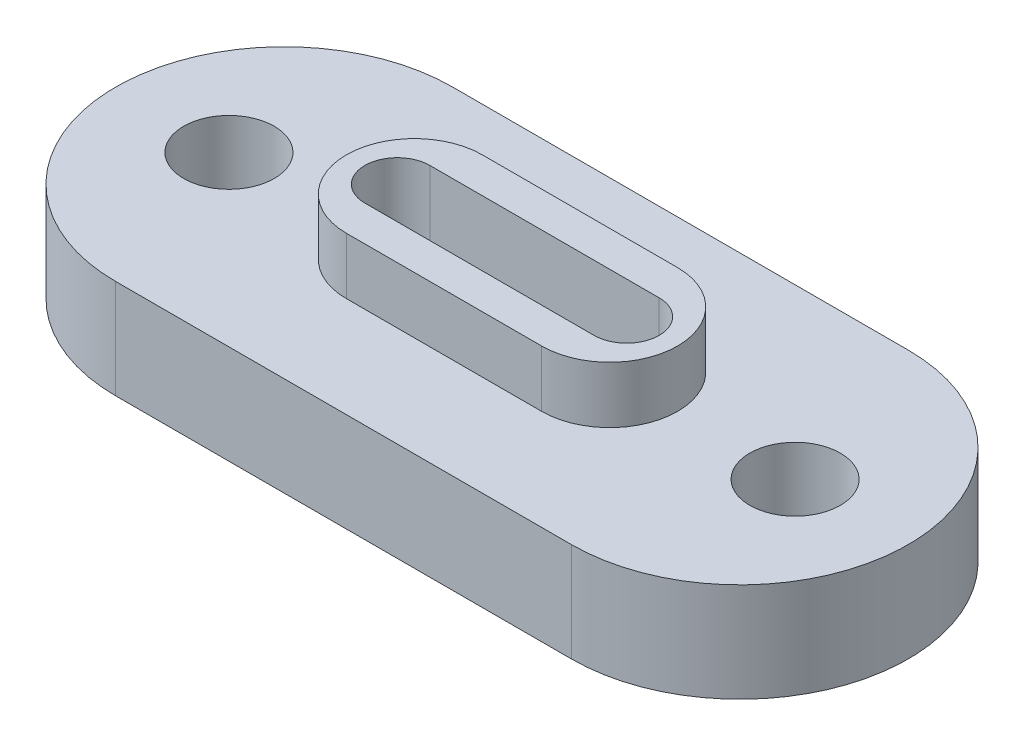
ISO-10303-21;
HEADER;
FILE_DESCRIPTION(('STEP AP214'),'2;1');
FILE_NAME('part.step','',(''),(''),'','','');
FILE_SCHEMA(('AUTOMOTIVE_DESIGN { 1 0 10303 214 1 1 1 1 }'));
ENDSEC;
DATA;
#1=APPLICATION_CONTEXT('core data for automotive mechanical design processes');
#2=APPLICATION_PROTOCOL_DEFINITION('international standard','automotive_design',2000,#1);
#3=PRODUCT_CONTEXT('',#1,'mechanical');
#4=PRODUCT('Part','Part','',(#3));
#5=PRODUCT_RELATED_PRODUCT_CATEGORY('part','',(#4));
#6=PRODUCT_DEFINITION_FORMATION('','',#4);
#7=PRODUCT_DEFINITION_CONTEXT('part definition',#1,'design');
#8=PRODUCT_DEFINITION('design','',#6,#7);
#9=PRODUCT_DEFINITION_SHAPE('','',#8);
#10=(LENGTH_UNIT() NAMED_UNIT(*) SI_UNIT(.MILLI.,.METRE.));
#11=(NAMED_UNIT(*) PLANE_ANGLE_UNIT() SI_UNIT($,.RADIAN.));
#12=(NAMED_UNIT(*) SI_UNIT($,.STERADIAN.) SOLID_ANGLE_UNIT());
#13=UNCERTAINTY_MEASURE_WITH_UNIT(LENGTH_MEASURE(1.E-05),#10,'distance_accuracy_value','');
#14=(GEOMETRIC_REPRESENTATION_CONTEXT(3) GLOBAL_UNCERTAINTY_ASSIGNED_CONTEXT((#13)) GLOBAL_UNIT_ASSIGNED_CONTEXT((#10,
#11,#12)) REPRESENTATION_CONTEXT('',''));
#15=CARTESIAN_POINT('',(0.,0.,0.));
#16=DIRECTION('',(0.,0.,1.));
#17=DIRECTION('',(1.,0.,0.));
#18=AXIS2_PLACEMENT_3D('',#15,#16,#17);
#19=CARTESIAN_POINT('',(-3.45,2.,0.));
#20=DIRECTION('',(0.,1.,0.));
#21=DIRECTION('',(0.,0.,1.));
#22=AXIS2_PLACEMENT_3D('',#19,#20,#21);
#23=PLANE('',#22);
#24=CARTESIAN_POINT('',(-3.45,2.,0.));
#25=DIRECTION('',(0.,1.,0.));
#26=DIRECTION('',(0.,0.,1.));
#27=AXIS2_PLACEMENT_3D('',#24,#25,#26);
#28=CIRCLE('',#27,2.4);
#29=CARTESIAN_POINT('',(-3.45,2.,-2.4));
#30=VERTEX_POINT('',#29);
#31=CARTESIAN_POINT('',(-3.45,2.,2.4));
#32=VERTEX_POINT('',#31);
#33=EDGE_CURVE('E99',#30,#32,#28,.T.);
#34=ORIENTED_EDGE('',*,*,#33,.T.);
#35=DIRECTION('',(1.,0.,0.));
#36=VECTOR('',#35,1.);
#37=CARTESIAN_POINT('',(-3.45,2.,2.4));
#38=LINE('',#37,#36);
#39=CARTESIAN_POINT('',(3.45,2.,2.4));
#40=VERTEX_POINT('',#39);
#41=EDGE_CURVE('E92',#32,#40,#38,.T.);
#42=ORIENTED_EDGE('',*,*,#41,.T.);
#43=CARTESIAN_POINT('',(3.45,2.,0.));
#44=DIRECTION('',(0.,1.,0.));
#45=DIRECTION('',(0.,0.,1.));
#46=AXIS2_PLACEMENT_3D('',#43,#44,#45);
#47=CIRCLE('',#46,2.4);
#48=CARTESIAN_POINT('',(3.45,2.,-2.4));
#49=VERTEX_POINT('',#48);
#50=EDGE_CURVE('E96',#40,#49,#47,.T.);
#51=ORIENTED_EDGE('',*,*,#50,.T.);
#52=DIRECTION('',(-1.,0.,0.));
#53=VECTOR('',#52,1.);
#54=CARTESIAN_POINT('',(-3.45,2.,-2.4));
#55=LINE('',#54,#53);
#56=EDGE_CURVE('E64',#49,#30,#55,.T.);
#57=ORIENTED_EDGE('',*,*,#56,.T.);
#58=EDGE_LOOP('',(#34,#42,#51,#57));
#59=FACE_BOUND('',#58,.T.);
#60=DIRECTION('',(1.,0.,0.));
#61=VECTOR('',#60,1.);
#62=CARTESIAN_POINT('',(-4.05,2.,1.15));
#63=LINE('',#62,#61);
#64=CARTESIAN_POINT('',(-4.05,2.,1.15));
#65=VERTEX_POINT('',#64);
#66=CARTESIAN_POINT('',(4.05,2.,1.15));
#67=VERTEX_POINT('',#66);
#68=EDGE_CURVE('E160',#65,#67,#63,.T.);
#69=ORIENTED_EDGE('',*,*,#68,.F.);
#70=CARTESIAN_POINT('',(-4.05,2.,0.));
#71=DIRECTION('',(0.,1.,0.));
#72=DIRECTION('',(0.,0.,1.));
#73=AXIS2_PLACEMENT_3D('',#70,#71,#72);
#74=CIRCLE('',#73,1.15);
#75=CARTESIAN_POINT('',(-4.05,2.,-1.15));
#76=VERTEX_POINT('',#75);
#77=EDGE_CURVE('E151',#76,#65,#74,.T.);
#78=ORIENTED_EDGE('',*,*,#77,.F.);
#79=DIRECTION('',(-1.,0.,0.));
#80=VECTOR('',#79,1.);
#81=CARTESIAN_POINT('',(-4.05,2.,-1.15));
#82=LINE('',#81,#80);
#83=CARTESIAN_POINT('',(4.05,2.,-1.15));
#84=VERTEX_POINT('',#83);
#85=EDGE_CURVE('E85',#84,#76,#82,.T.);
#86=ORIENTED_EDGE('',*,*,#85,.F.);
#87=CARTESIAN_POINT('',(4.05,2.,0.));
#88=DIRECTION('',(0.,1.,0.));
#89=DIRECTION('',(0.,0.,1.));
#90=AXIS2_PLACEMENT_3D('',#87,#88,#89);
#91=CIRCLE('',#90,1.15);
#92=EDGE_CURVE('E174',#67,#84,#91,.T.);
#93=ORIENTED_EDGE('',*,*,#92,.F.);
#94=EDGE_LOOP('',(#69,#78,#86,#93));
#95=FACE_BOUND('',#94,.T.);
#96=ADVANCED_FACE('F39',(#59,#95),#23,.T.);
#97=CARTESIAN_POINT('',(-3.45,2.,0.));
#98=DIRECTION('',(0.,-1.,0.));
#99=DIRECTION('',(0.,0.,-1.));
#100=AXIS2_PLACEMENT_3D('',#97,#98,#99);
#101=CYLINDRICAL_SURFACE('',#100,2.4);
#102=CARTESIAN_POINT('',(-3.45,0.,0.));
#103=DIRECTION('',(0.,1.,0.));
#104=DIRECTION('',(0.,0.,1.));
#105=AXIS2_PLACEMENT_3D('',#102,#103,#104);
#106=CIRCLE('',#105,2.4);
#107=CARTESIAN_POINT('',(-3.45,0.,-2.4));
#108=VERTEX_POINT('',#107);
#109=CARTESIAN_POINT('',(-3.45,0.,2.4));
#110=VERTEX_POINT('',#109);
#111=EDGE_CURVE('E119',#108,#110,#106,.T.);
#112=ORIENTED_EDGE('',*,*,#111,.T.);
#113=DIRECTION('',(0.,-1.,0.));
#114=VECTOR('',#113,1.);
#115=CARTESIAN_POINT('',(-3.45,2.,2.4));
#116=LINE('',#115,#114);
#117=EDGE_CURVE('E11',#32,#110,#116,.T.);
#118=ORIENTED_EDGE('',*,*,#117,.F.);
#119=ORIENTED_EDGE('',*,*,#33,.F.);
#120=DIRECTION('',(0.,-1.,0.));
#121=VECTOR('',#120,1.);
#122=CARTESIAN_POINT('',(-3.45,2.,-2.4));
#123=LINE('',#122,#121);
#124=EDGE_CURVE('E115',#30,#108,#123,.T.);
#125=ORIENTED_EDGE('',*,*,#124,.T.);
#126=EDGE_LOOP('',(#112,#118,#119,#125));
#127=FACE_BOUND('',#126,.T.);
#128=ADVANCED_FACE('F41',(#127),#101,.T.);
#129=CARTESIAN_POINT('',(-3.45,2.,2.4));
#130=DIRECTION('',(0.,0.,-1.));
#131=DIRECTION('',(-1.,0.,0.));
#132=AXIS2_PLACEMENT_3D('',#129,#130,#131);
#133=PLANE('',#132);
#134=DIRECTION('',(1.,0.,0.));
#135=VECTOR('',#134,1.);
#136=CARTESIAN_POINT('',(-3.45,0.,2.4));
#137=LINE('',#136,#135);
#138=CARTESIAN_POINT('',(3.45,0.,2.4));
#139=VERTEX_POINT('',#138);
#140=EDGE_CURVE('E106',#110,#139,#137,.T.);
#141=ORIENTED_EDGE('',*,*,#140,.T.);
#142=DIRECTION('',(0.,-1.,0.));
#143=VECTOR('',#142,1.);
#144=CARTESIAN_POINT('',(3.45,2.,2.4));
#145=LINE('',#144,#143);
#146=EDGE_CURVE('E48',#40,#139,#145,.T.);
#147=ORIENTED_EDGE('',*,*,#146,.F.);
#148=ORIENTED_EDGE('',*,*,#41,.F.);
#149=ORIENTED_EDGE('',*,*,#117,.T.);
#150=EDGE_LOOP('',(#141,#147,#148,#149));
#151=FACE_BOUND('',#150,.T.);
#152=ADVANCED_FACE('F105',(#151),#133,.F.);
#153=CARTESIAN_POINT('',(3.45,2.,0.));
#154=DIRECTION('',(0.,-1.,0.));
#155=DIRECTION('',(0.,0.,-1.));
#156=AXIS2_PLACEMENT_3D('',#153,#154,#155);
#157=CYLINDRICAL_SURFACE('',#156,2.4);
#158=CARTESIAN_POINT('',(3.45,0.,0.));
#159=DIRECTION('',(0.,1.,0.));
#160=DIRECTION('',(0.,0.,1.));
#161=AXIS2_PLACEMENT_3D('',#158,#159,#160);
#162=CIRCLE('',#161,2.4);
#163=CARTESIAN_POINT('',(3.45,0.,-2.4));
#164=VERTEX_POINT('',#163);
#165=EDGE_CURVE('E77',#139,#164,#162,.T.);
#166=ORIENTED_EDGE('',*,*,#165,.T.);
#167=DIRECTION('',(0.,-1.,0.));
#168=VECTOR('',#167,1.);
#169=CARTESIAN_POINT('',(3.45,2.,-2.4));
#170=LINE('',#169,#168);
#171=EDGE_CURVE('E109',#49,#164,#170,.T.);
#172=ORIENTED_EDGE('',*,*,#171,.F.);
#173=ORIENTED_EDGE('',*,*,#50,.F.);
#174=ORIENTED_EDGE('',*,*,#146,.T.);
#175=EDGE_LOOP('',(#166,#172,#173,#174));
#176=FACE_BOUND('',#175,.T.);
#177=ADVANCED_FACE('F110',(#176),#157,.T.);
#178=CARTESIAN_POINT('',(-3.45,2.,-2.4));
#179=DIRECTION('',(0.,0.,1.));
#180=DIRECTION('',(1.,0.,0.));
#181=AXIS2_PLACEMENT_3D('',#178,#179,#180);
#182=PLANE('',#181);
#183=DIRECTION('',(-1.,0.,0.));
#184=VECTOR('',#183,1.);
#185=CARTESIAN_POINT('',(-3.45,0.,-2.4));
#186=LINE('',#185,#184);
#187=EDGE_CURVE('E128',#164,#108,#186,.T.);
#188=ORIENTED_EDGE('',*,*,#187,.T.);
#189=ORIENTED_EDGE('',*,*,#124,.F.);
#190=ORIENTED_EDGE('',*,*,#56,.F.);
#191=ORIENTED_EDGE('',*,*,#171,.T.);
#192=EDGE_LOOP('',(#188,#189,#190,#191));
#193=FACE_BOUND('',#192,.T.);
#194=ADVANCED_FACE('F138',(#193),#182,.F.);
#195=CARTESIAN_POINT('',(-4.05,2.,0.));
#196=DIRECTION('',(0.,-1.,0.));
#197=DIRECTION('',(0.,0.,-1.));
#198=AXIS2_PLACEMENT_3D('',#195,#196,#197);
#199=CYLINDRICAL_SURFACE('',#198,1.15);
#200=DIRECTION('',(0.,-1.,0.));
#201=VECTOR('',#200,1.);
#202=CARTESIAN_POINT('',(-4.05,2.,1.15));
#203=LINE('',#202,#201);
#204=CARTESIAN_POINT('',(-4.05,-3.5,1.15));
#205=VERTEX_POINT('',#204);
#206=EDGE_CURVE('E123',#65,#205,#203,.T.);
#207=ORIENTED_EDGE('',*,*,#206,.T.);
#208=CARTESIAN_POINT('',(-4.05,-3.5,0.));
#209=DIRECTION('',(0.,-1.,0.));
#210=DIRECTION('',(0.,0.,-1.));
#211=AXIS2_PLACEMENT_3D('',#208,#209,#210);
#212=CIRCLE('',#211,1.15);
#213=CARTESIAN_POINT('',(-4.05,-3.5,-1.15));
#214=VERTEX_POINT('',#213);
#215=EDGE_CURVE('E204',#205,#214,#212,.T.);
#216=ORIENTED_EDGE('',*,*,#215,.T.);
#217=DIRECTION('',(0.,-1.,0.));
#218=VECTOR('',#217,1.);
#219=CARTESIAN_POINT('',(-4.05,2.,-1.15));
#220=LINE('',#219,#218);
#221=EDGE_CURVE('E157',#76,#214,#220,.T.);
#222=ORIENTED_EDGE('',*,*,#221,.F.);
#223=ORIENTED_EDGE('',*,*,#77,.T.);
#224=EDGE_LOOP('',(#207,#216,#222,#223));
#225=FACE_BOUND('',#224,.T.);
#226=ADVANCED_FACE('F153',(#225),#199,.F.);
#227=CARTESIAN_POINT('',(-4.05,2.,1.15));
#228=DIRECTION('',(0.,0.,-1.));
#229=DIRECTION('',(-1.,0.,0.));
#230=AXIS2_PLACEMENT_3D('',#227,#228,#229);
#231=PLANE('',#230);
#232=DIRECTION('',(0.,-1.,0.));
#233=VECTOR('',#232,1.);
#234=CARTESIAN_POINT('',(4.05,2.,1.15));
#235=LINE('',#234,#233);
#236=CARTESIAN_POINT('',(4.05,-3.5,1.15));
#237=VERTEX_POINT('',#236);
#238=EDGE_CURVE('E171',#67,#237,#235,.T.);
#239=ORIENTED_EDGE('',*,*,#238,.T.);
#240=DIRECTION('',(-1.,0.,0.));
#241=VECTOR('',#240,1.);
#242=CARTESIAN_POINT('',(4.05,-3.5,1.15));
#243=LINE('',#242,#241);
#244=EDGE_CURVE('E168',#237,#205,#243,.T.);
#245=ORIENTED_EDGE('',*,*,#244,.T.);
#246=ORIENTED_EDGE('',*,*,#206,.F.);
#247=ORIENTED_EDGE('',*,*,#68,.T.);
#248=EDGE_LOOP('',(#239,#245,#246,#247));
#249=FACE_BOUND('',#248,.T.);
#250=ADVANCED_FACE('F165',(#249),#231,.T.);
#251=CARTESIAN_POINT('',(4.05,2.,0.));
#252=DIRECTION('',(0.,-1.,0.));
#253=DIRECTION('',(0.,0.,-1.));
#254=AXIS2_PLACEMENT_3D('',#251,#252,#253);
#255=CYLINDRICAL_SURFACE('',#254,1.15);
#256=DIRECTION('',(0.,-1.,0.));
#257=VECTOR('',#256,1.);
#258=CARTESIAN_POINT('',(4.05,2.,-1.15));
#259=LINE('',#258,#257);
#260=CARTESIAN_POINT('',(4.05,-3.5,-1.15));
#261=VERTEX_POINT('',#260);
#262=EDGE_CURVE('E55',#84,#261,#259,.T.);
#263=ORIENTED_EDGE('',*,*,#262,.T.);
#264=CARTESIAN_POINT('',(4.05,-3.5,0.));
#265=DIRECTION('',(0.,-1.,0.));
#266=DIRECTION('',(0.,0.,-1.));
#267=AXIS2_PLACEMENT_3D('',#264,#265,#266);
#268=CIRCLE('',#267,1.15);
#269=EDGE_CURVE('E194',#261,#237,#268,.T.);
#270=ORIENTED_EDGE('',*,*,#269,.T.);
#271=ORIENTED_EDGE('',*,*,#238,.F.);
#272=ORIENTED_EDGE('',*,*,#92,.T.);
#273=EDGE_LOOP('',(#263,#270,#271,#272));
#274=FACE_BOUND('',#273,.T.);
#275=ADVANCED_FACE('F195',(#274),#255,.F.);
#276=CARTESIAN_POINT('',(-4.05,2.,-1.15));
#277=DIRECTION('',(0.,0.,1.));
#278=DIRECTION('',(1.,0.,0.));
#279=AXIS2_PLACEMENT_3D('',#276,#277,#278);
#280=PLANE('',#279);
#281=ORIENTED_EDGE('',*,*,#221,.T.);
#282=DIRECTION('',(1.,0.,0.));
#283=VECTOR('',#282,1.);
#284=CARTESIAN_POINT('',(4.05,-3.5,-1.15));
#285=LINE('',#284,#283);
#286=EDGE_CURVE('E208',#214,#261,#285,.T.);
#287=ORIENTED_EDGE('',*,*,#286,.T.);
#288=ORIENTED_EDGE('',*,*,#262,.F.);
#289=ORIENTED_EDGE('',*,*,#85,.T.);
#290=EDGE_LOOP('',(#281,#287,#288,#289));
#291=FACE_BOUND('',#290,.T.);
#292=ADVANCED_FACE('F354',(#291),#280,.T.);
#293=CARTESIAN_POINT('',(-8.05,-3.5,0.));
#294=DIRECTION('',(0.,-1.,0.));
#295=DIRECTION('',(0.,0.,-1.));
#296=AXIS2_PLACEMENT_3D('',#293,#294,#295);
#297=PLANE('',#296);
#298=CARTESIAN_POINT('',(-10.,-3.5,0.));
#299=DIRECTION('',(0.,-1.,0.));
#300=DIRECTION('',(0.,0.,-1.));
#301=AXIS2_PLACEMENT_3D('',#298,#299,#300);
#302=CIRCLE('',#301,1.6);
#303=CARTESIAN_POINT('',(-10.,-3.5,-1.6));
#304=VERTEX_POINT('',#303);
#305=EDGE_CURVE('E200',#304,#304,#302,.T.);
#306=ORIENTED_EDGE('',*,*,#305,.F.);
#307=EDGE_LOOP('',(#306));
#308=FACE_BOUND('',#307,.T.);
#309=CARTESIAN_POINT('',(-8.05,-3.5,0.));
#310=DIRECTION('',(0.,-1.,0.));
#311=DIRECTION('',(0.,0.,-1.));
#312=AXIS2_PLACEMENT_3D('',#309,#310,#311);
#313=CIRCLE('',#312,5.95);
#314=CARTESIAN_POINT('',(-8.05,-3.5,5.95));
#315=VERTEX_POINT('',#314);
#316=CARTESIAN_POINT('',(-8.05,-3.5,-5.95));
#317=VERTEX_POINT('',#316);
#318=EDGE_CURVE('E215',#315,#317,#313,.T.);
#319=ORIENTED_EDGE('',*,*,#318,.T.);
#320=DIRECTION('',(1.,0.,0.));
#321=VECTOR('',#320,1.);
#322=CARTESIAN_POINT('',(-8.05,-3.5,-5.95));
#323=LINE('',#322,#321);
#324=CARTESIAN_POINT('',(8.05,-3.5,-5.95));
#325=VERTEX_POINT('',#324);
#326=EDGE_CURVE('E219',#317,#325,#323,.T.);
#327=ORIENTED_EDGE('',*,*,#326,.T.);
#328=CARTESIAN_POINT('',(8.05,-3.5,0.));
#329=DIRECTION('',(0.,-1.,0.));
#330=DIRECTION('',(0.,0.,-1.));
#331=AXIS2_PLACEMENT_3D('',#328,#329,#330);
#332=CIRCLE('',#331,5.95);
#333=CARTESIAN_POINT('',(8.05,-3.5,5.95));
#334=VERTEX_POINT('',#333);
#335=EDGE_CURVE('E224',#325,#334,#332,.T.);
#336=ORIENTED_EDGE('',*,*,#335,.T.);
#337=DIRECTION('',(-1.,0.,0.));
#338=VECTOR('',#337,1.);
#339=CARTESIAN_POINT('',(-8.05,-3.5,5.95));
#340=LINE('',#339,#338);
#341=EDGE_CURVE('E228',#334,#315,#340,.T.);
#342=ORIENTED_EDGE('',*,*,#341,.T.);
#343=EDGE_LOOP('',(#319,#327,#336,#342));
#344=FACE_BOUND('',#343,.T.);
#345=ORIENTED_EDGE('',*,*,#244,.F.);
#346=ORIENTED_EDGE('',*,*,#269,.F.);
#347=ORIENTED_EDGE('',*,*,#286,.F.);
#348=ORIENTED_EDGE('',*,*,#215,.F.);
#349=EDGE_LOOP('',(#345,#346,#347,#348));
#350=FACE_BOUND('',#349,.T.);
#351=CARTESIAN_POINT('',(10.,-3.5,0.));
#352=DIRECTION('',(0.,-1.,0.));
#353=DIRECTION('',(0.,0.,-1.));
#354=AXIS2_PLACEMENT_3D('',#351,#352,#353);
#355=CIRCLE('',#354,1.6);
#356=CARTESIAN_POINT('',(10.,-3.5,-1.6));
#357=VERTEX_POINT('',#356);
#358=EDGE_CURVE('E415',#357,#357,#355,.T.);
#359=ORIENTED_EDGE('',*,*,#358,.F.);
#360=EDGE_LOOP('',(#359));
#361=FACE_BOUND('',#360,.T.);
#362=ADVANCED_FACE('F202',(#308,#344,#350,#361),#297,.T.);
#363=CARTESIAN_POINT('',(-8.05,0.,0.));
#364=DIRECTION('',(0.,-1.,0.));
#365=DIRECTION('',(0.,0.,-1.));
#366=AXIS2_PLACEMENT_3D('',#363,#364,#365);
#367=PLANE('',#366);
#368=ORIENTED_EDGE('',*,*,#111,.F.);
#369=ORIENTED_EDGE('',*,*,#187,.F.);
#370=ORIENTED_EDGE('',*,*,#165,.F.);
#371=ORIENTED_EDGE('',*,*,#140,.F.);
#372=EDGE_LOOP('',(#368,#369,#370,#371));
#373=FACE_BOUND('',#372,.T.);
#374=CARTESIAN_POINT('',(-8.05,0.,0.));
#375=DIRECTION('',(0.,-1.,0.));
#376=DIRECTION('',(0.,0.,-1.));
#377=AXIS2_PLACEMENT_3D('',#374,#375,#376);
#378=CIRCLE('',#377,5.95);
#379=CARTESIAN_POINT('',(-8.05,0.,5.95));
#380=VERTEX_POINT('',#379);
#381=CARTESIAN_POINT('',(-8.05,0.,-5.95));
#382=VERTEX_POINT('',#381);
#383=EDGE_CURVE('E214',#380,#382,#378,.T.);
#384=ORIENTED_EDGE('',*,*,#383,.F.);
#385=DIRECTION('',(-1.,0.,0.));
#386=VECTOR('',#385,1.);
#387=CARTESIAN_POINT('',(-8.05,0.,5.95));
#388=LINE('',#387,#386);
#389=CARTESIAN_POINT('',(8.05,0.,5.95));
#390=VERTEX_POINT('',#389);
#391=EDGE_CURVE('E220',#390,#380,#388,.T.);
#392=ORIENTED_EDGE('',*,*,#391,.F.);
#393=CARTESIAN_POINT('',(8.05,0.,0.));
#394=DIRECTION('',(0.,-1.,0.));
#395=DIRECTION('',(0.,0.,-1.));
#396=AXIS2_PLACEMENT_3D('',#393,#394,#395);
#397=CIRCLE('',#396,5.95);
#398=CARTESIAN_POINT('',(8.05,0.,-5.95));
#399=VERTEX_POINT('',#398);
#400=EDGE_CURVE('E240',#399,#390,#397,.T.);
#401=ORIENTED_EDGE('',*,*,#400,.F.);
#402=DIRECTION('',(1.,0.,0.));
#403=VECTOR('',#402,1.);
#404=CARTESIAN_POINT('',(-8.05,0.,-5.95));
#405=LINE('',#404,#403);
#406=EDGE_CURVE('E236',#382,#399,#405,.T.);
#407=ORIENTED_EDGE('',*,*,#406,.F.);
#408=EDGE_LOOP('',(#384,#392,#401,#407));
#409=FACE_BOUND('',#408,.T.);
#410=CARTESIAN_POINT('',(-10.,0.,0.));
#411=DIRECTION('',(0.,-1.,0.));
#412=DIRECTION('',(0.,0.,-1.));
#413=AXIS2_PLACEMENT_3D('',#410,#411,#412);
#414=CIRCLE('',#413,1.6);
#415=CARTESIAN_POINT('',(-10.,0.,-1.6));
#416=VERTEX_POINT('',#415);
#417=EDGE_CURVE('E423',#416,#416,#414,.T.);
#418=ORIENTED_EDGE('',*,*,#417,.T.);
#419=EDGE_LOOP('',(#418));
#420=FACE_BOUND('',#419,.T.);
#421=CARTESIAN_POINT('',(10.,0.,0.));
#422=DIRECTION('',(0.,-1.,0.));
#423=DIRECTION('',(0.,0.,-1.));
#424=AXIS2_PLACEMENT_3D('',#421,#422,#423);
#425=CIRCLE('',#424,1.6);
#426=CARTESIAN_POINT('',(10.,0.,-1.6));
#427=VERTEX_POINT('',#426);
#428=EDGE_CURVE('E418',#427,#427,#425,.T.);
#429=ORIENTED_EDGE('',*,*,#428,.T.);
#430=EDGE_LOOP('',(#429));
#431=FACE_BOUND('',#430,.T.);
#432=ADVANCED_FACE('F277',(#373,#409,#420,#431),#367,.F.);
#433=CARTESIAN_POINT('',(-8.05,-3.5,0.));
#434=DIRECTION('',(0.,1.,0.));
#435=DIRECTION('',(0.,0.,1.));
#436=AXIS2_PLACEMENT_3D('',#433,#434,#435);
#437=CYLINDRICAL_SURFACE('',#436,5.95);
#438=ORIENTED_EDGE('',*,*,#383,.T.);
#439=DIRECTION('',(0.,1.,0.));
#440=VECTOR('',#439,1.);
#441=CARTESIAN_POINT('',(-8.05,-3.5,-5.95));
#442=LINE('',#441,#440);
#443=EDGE_CURVE('E161',#317,#382,#442,.T.);
#444=ORIENTED_EDGE('',*,*,#443,.F.);
#445=ORIENTED_EDGE('',*,*,#318,.F.);
#446=DIRECTION('',(0.,1.,0.));
#447=VECTOR('',#446,1.);
#448=CARTESIAN_POINT('',(-8.05,-3.5,5.95));
#449=LINE('',#448,#447);
#450=EDGE_CURVE('E232',#315,#380,#449,.T.);
#451=ORIENTED_EDGE('',*,*,#450,.T.);
#452=EDGE_LOOP('',(#438,#444,#445,#451));
#453=FACE_BOUND('',#452,.T.);
#454=ADVANCED_FACE('F272',(#453),#437,.T.);
#455=CARTESIAN_POINT('',(-8.05,-3.5,-5.95));
#456=DIRECTION('',(0.,0.,1.));
#457=DIRECTION('',(1.,0.,0.));
#458=AXIS2_PLACEMENT_3D('',#455,#456,#457);
#459=PLANE('',#458);
#460=ORIENTED_EDGE('',*,*,#406,.T.);
#461=DIRECTION('',(0.,1.,0.));
#462=VECTOR('',#461,1.);
#463=CARTESIAN_POINT('',(8.05,-3.5,-5.95));
#464=LINE('',#463,#462);
#465=EDGE_CURVE('E254',#325,#399,#464,.T.);
#466=ORIENTED_EDGE('',*,*,#465,.F.);
#467=ORIENTED_EDGE('',*,*,#326,.F.);
#468=ORIENTED_EDGE('',*,*,#443,.T.);
#469=EDGE_LOOP('',(#460,#466,#467,#468));
#470=FACE_BOUND('',#469,.T.);
#471=ADVANCED_FACE('F263',(#470),#459,.F.);
#472=CARTESIAN_POINT('',(8.05,-3.5,0.));
#473=DIRECTION('',(0.,1.,0.));
#474=DIRECTION('',(0.,0.,1.));
#475=AXIS2_PLACEMENT_3D('',#472,#473,#474);
#476=CYLINDRICAL_SURFACE('',#475,5.95);
#477=ORIENTED_EDGE('',*,*,#400,.T.);
#478=DIRECTION('',(0.,1.,0.));
#479=VECTOR('',#478,1.);
#480=CARTESIAN_POINT('',(8.05,-3.5,5.95));
#481=LINE('',#480,#479);
#482=EDGE_CURVE('E250',#334,#390,#481,.T.);
#483=ORIENTED_EDGE('',*,*,#482,.F.);
#484=ORIENTED_EDGE('',*,*,#335,.F.);
#485=ORIENTED_EDGE('',*,*,#465,.T.);
#486=EDGE_LOOP('',(#477,#483,#484,#485));
#487=FACE_BOUND('',#486,.T.);
#488=ADVANCED_FACE('F299',(#487),#476,.T.);
#489=CARTESIAN_POINT('',(-8.05,-3.5,5.95));
#490=DIRECTION('',(0.,0.,-1.));
#491=DIRECTION('',(-1.,0.,0.));
#492=AXIS2_PLACEMENT_3D('',#489,#490,#491);
#493=PLANE('',#492);
#494=ORIENTED_EDGE('',*,*,#391,.T.);
#495=ORIENTED_EDGE('',*,*,#450,.F.);
#496=ORIENTED_EDGE('',*,*,#341,.F.);
#497=ORIENTED_EDGE('',*,*,#482,.T.);
#498=EDGE_LOOP('',(#494,#495,#496,#497));
#499=FACE_BOUND('',#498,.T.);
#500=ADVANCED_FACE('F300',(#499),#493,.F.);
#501=CARTESIAN_POINT('',(-10.,-3.5,0.));
#502=DIRECTION('',(0.,1.,0.));
#503=DIRECTION('',(0.,0.,1.));
#504=AXIS2_PLACEMENT_3D('',#501,#502,#503);
#505=CYLINDRICAL_SURFACE('',#504,1.6);
#506=ORIENTED_EDGE('',*,*,#305,.T.);
#507=EDGE_LOOP('',(#506));
#508=FACE_BOUND('',#507,.T.);
#509=ORIENTED_EDGE('',*,*,#417,.F.);
#510=EDGE_LOOP('',(#509));
#511=FACE_BOUND('',#510,.T.);
#512=ADVANCED_FACE('F302',(#508,#511),#505,.F.);
#513=CARTESIAN_POINT('',(10.,-3.5,0.));
#514=DIRECTION('',(0.,1.,0.));
#515=DIRECTION('',(0.,0.,1.));
#516=AXIS2_PLACEMENT_3D('',#513,#514,#515);
#517=CYLINDRICAL_SURFACE('',#516,1.6);
#518=ORIENTED_EDGE('',*,*,#358,.T.);
#519=EDGE_LOOP('',(#518));
#520=FACE_BOUND('',#519,.T.);
#521=ORIENTED_EDGE('',*,*,#428,.F.);
#522=EDGE_LOOP('',(#521));
#523=FACE_BOUND('',#522,.T.);
#524=ADVANCED_FACE('F308',(#520,#523),#517,.F.);
#525=CLOSED_SHELL('',(#96,#128,#152,#177,#194,#226,#250,#275,#292,#362,#432,#454,#471,#488,#500,
#512,#524));
#526=MANIFOLD_SOLID_BREP('B2',#525);
#527=ADVANCED_BREP_SHAPE_REPRESENTATION('',(#18,#526),#14);
#528=SHAPE_DEFINITION_REPRESENTATION(#9,#527);
ENDSEC;
END-ISO-10303-21;
